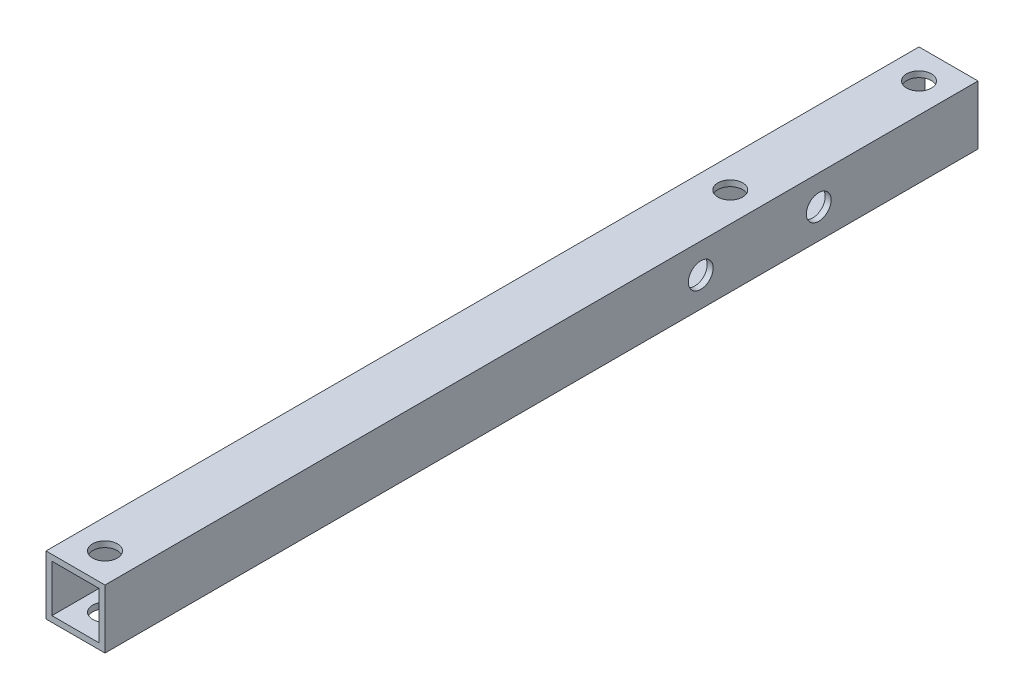
ISO-10303-21;
HEADER;
FILE_DESCRIPTION(('STEP AP214'),'2;1');
FILE_NAME('part.step','',(''),(''),'','','');
FILE_SCHEMA(('AUTOMOTIVE_DESIGN { 1 0 10303 214 1 1 1 1 }'));
ENDSEC;
DATA;
#1=APPLICATION_CONTEXT('core data for automotive mechanical design processes');
#2=APPLICATION_PROTOCOL_DEFINITION('international standard','automotive_design',2000,#1);
#3=PRODUCT_CONTEXT('',#1,'mechanical');
#4=PRODUCT('Part','Part','',(#3));
#5=PRODUCT_RELATED_PRODUCT_CATEGORY('part','',(#4));
#6=PRODUCT_DEFINITION_FORMATION('','',#4);
#7=PRODUCT_DEFINITION_CONTEXT('part definition',#1,'design');
#8=PRODUCT_DEFINITION('design','',#6,#7);
#9=PRODUCT_DEFINITION_SHAPE('','',#8);
#10=(LENGTH_UNIT() NAMED_UNIT(*) SI_UNIT(.MILLI.,.METRE.));
#11=(NAMED_UNIT(*) PLANE_ANGLE_UNIT() SI_UNIT($,.RADIAN.));
#12=(NAMED_UNIT(*) SI_UNIT($,.STERADIAN.) SOLID_ANGLE_UNIT());
#13=UNCERTAINTY_MEASURE_WITH_UNIT(LENGTH_MEASURE(1.E-05),#10,'distance_accuracy_value','');
#14=(GEOMETRIC_REPRESENTATION_CONTEXT(3) GLOBAL_UNCERTAINTY_ASSIGNED_CONTEXT((#13)) GLOBAL_UNIT_ASSIGNED_CONTEXT((#10,
#11,#12)) REPRESENTATION_CONTEXT('',''));
#15=CARTESIAN_POINT('',(0.,0.,0.));
#16=DIRECTION('',(0.,0.,1.));
#17=DIRECTION('',(1.,0.,0.));
#18=AXIS2_PLACEMENT_3D('',#15,#16,#17);
#19=CARTESIAN_POINT('',(0.,0.,148.));
#20=DIRECTION('',(0.,0.,1.));
#21=DIRECTION('',(1.,0.,0.));
#22=AXIS2_PLACEMENT_3D('',#19,#20,#21);
#23=PLANE('',#22);
#24=DIRECTION('',(0.,-1.,0.));
#25=VECTOR('',#24,1.);
#26=CARTESIAN_POINT('',(0.,0.,148.));
#27=LINE('',#26,#25);
#28=CARTESIAN_POINT('',(0.,0.,148.));
#29=VERTEX_POINT('',#28);
#30=CARTESIAN_POINT('',(0.,-10.,148.));
#31=VERTEX_POINT('',#30);
#32=EDGE_CURVE('E185',#29,#31,#27,.T.);
#33=ORIENTED_EDGE('',*,*,#32,.T.);
#34=DIRECTION('',(1.,0.,0.));
#35=VECTOR('',#34,1.);
#36=CARTESIAN_POINT('',(0.,-10.,148.));
#37=LINE('',#36,#35);
#38=CARTESIAN_POINT('',(10.,-10.,148.));
#39=VERTEX_POINT('',#38);
#40=EDGE_CURVE('E189',#31,#39,#37,.T.);
#41=ORIENTED_EDGE('',*,*,#40,.T.);
#42=DIRECTION('',(0.,1.,0.));
#43=VECTOR('',#42,1.);
#44=CARTESIAN_POINT('',(10.,0.,148.));
#45=LINE('',#44,#43);
#46=CARTESIAN_POINT('',(10.,0.,148.));
#47=VERTEX_POINT('',#46);
#48=EDGE_CURVE('E193',#39,#47,#45,.T.);
#49=ORIENTED_EDGE('',*,*,#48,.T.);
#50=DIRECTION('',(-1.,0.,0.));
#51=VECTOR('',#50,1.);
#52=CARTESIAN_POINT('',(0.,0.,148.));
#53=LINE('',#52,#51);
#54=EDGE_CURVE('E196',#47,#29,#53,.T.);
#55=ORIENTED_EDGE('',*,*,#54,.T.);
#56=EDGE_LOOP('',(#33,#41,#49,#55));
#57=FACE_BOUND('',#56,.T.);
#58=DIRECTION('',(1.,0.,0.));
#59=VECTOR('',#58,1.);
#60=CARTESIAN_POINT('',(0.,-9.,148.));
#61=LINE('',#60,#59);
#62=CARTESIAN_POINT('',(1.,-9.,148.));
#63=VERTEX_POINT('',#62);
#64=CARTESIAN_POINT('',(9.,-9.,148.));
#65=VERTEX_POINT('',#64);
#66=EDGE_CURVE('E144',#63,#65,#61,.T.);
#67=ORIENTED_EDGE('',*,*,#66,.F.);
#68=DIRECTION('',(0.,-1.,0.));
#69=VECTOR('',#68,1.);
#70=CARTESIAN_POINT('',(1.,0.,148.));
#71=LINE('',#70,#69);
#72=CARTESIAN_POINT('',(1.,-1.,148.));
#73=VERTEX_POINT('',#72);
#74=EDGE_CURVE('E135',#73,#63,#71,.T.);
#75=ORIENTED_EDGE('',*,*,#74,.F.);
#76=DIRECTION('',(-1.,0.,0.));
#77=VECTOR('',#76,1.);
#78=CARTESIAN_POINT('',(0.,-1.,148.));
#79=LINE('',#78,#77);
#80=CARTESIAN_POINT('',(9.,-1.,148.));
#81=VERTEX_POINT('',#80);
#82=EDGE_CURVE('E161',#81,#73,#79,.T.);
#83=ORIENTED_EDGE('',*,*,#82,.F.);
#84=DIRECTION('',(0.,1.,0.));
#85=VECTOR('',#84,1.);
#86=CARTESIAN_POINT('',(9.,0.,148.));
#87=LINE('',#86,#85);
#88=EDGE_CURVE('E157',#65,#81,#87,.T.);
#89=ORIENTED_EDGE('',*,*,#88,.F.);
#90=EDGE_LOOP('',(#67,#75,#83,#89));
#91=FACE_BOUND('',#90,.T.);
#92=ADVANCED_FACE('F67',(#57,#91),#23,.T.);
#93=CARTESIAN_POINT('',(0.,0.,0.));
#94=DIRECTION('',(0.,0.,1.));
#95=DIRECTION('',(1.,0.,0.));
#96=AXIS2_PLACEMENT_3D('',#93,#94,#95);
#97=PLANE('',#96);
#98=DIRECTION('',(0.,-1.,0.));
#99=VECTOR('',#98,1.);
#100=CARTESIAN_POINT('',(0.,0.,0.));
#101=LINE('',#100,#99);
#102=CARTESIAN_POINT('',(0.,0.,0.));
#103=VERTEX_POINT('',#102);
#104=CARTESIAN_POINT('',(0.,-10.,0.));
#105=VERTEX_POINT('',#104);
#106=EDGE_CURVE('E153',#103,#105,#101,.T.);
#107=ORIENTED_EDGE('',*,*,#106,.F.);
#108=DIRECTION('',(-1.,0.,0.));
#109=VECTOR('',#108,1.);
#110=CARTESIAN_POINT('',(0.,0.,0.));
#111=LINE('',#110,#109);
#112=CARTESIAN_POINT('',(10.,0.,0.));
#113=VERTEX_POINT('',#112);
#114=EDGE_CURVE('E190',#113,#103,#111,.T.);
#115=ORIENTED_EDGE('',*,*,#114,.F.);
#116=DIRECTION('',(0.,1.,0.));
#117=VECTOR('',#116,1.);
#118=CARTESIAN_POINT('',(10.,0.,0.));
#119=LINE('',#118,#117);
#120=CARTESIAN_POINT('',(10.,-10.,0.));
#121=VERTEX_POINT('',#120);
#122=EDGE_CURVE('E206',#121,#113,#119,.T.);
#123=ORIENTED_EDGE('',*,*,#122,.F.);
#124=DIRECTION('',(1.,0.,0.));
#125=VECTOR('',#124,1.);
#126=CARTESIAN_POINT('',(0.,-10.,0.));
#127=LINE('',#126,#125);
#128=EDGE_CURVE('E203',#105,#121,#127,.T.);
#129=ORIENTED_EDGE('',*,*,#128,.F.);
#130=EDGE_LOOP('',(#107,#115,#123,#129));
#131=FACE_BOUND('',#130,.T.);
#132=DIRECTION('',(0.,-1.,0.));
#133=VECTOR('',#132,1.);
#134=CARTESIAN_POINT('',(1.,0.,0.));
#135=LINE('',#134,#133);
#136=CARTESIAN_POINT('',(1.,-1.,0.));
#137=VERTEX_POINT('',#136);
#138=CARTESIAN_POINT('',(1.,-9.,0.));
#139=VERTEX_POINT('',#138);
#140=EDGE_CURVE('E93',#137,#139,#135,.T.);
#141=ORIENTED_EDGE('',*,*,#140,.T.);
#142=DIRECTION('',(1.,0.,0.));
#143=VECTOR('',#142,1.);
#144=CARTESIAN_POINT('',(0.,-9.,0.));
#145=LINE('',#144,#143);
#146=CARTESIAN_POINT('',(9.,-9.,0.));
#147=VERTEX_POINT('',#146);
#148=EDGE_CURVE('E151',#139,#147,#145,.T.);
#149=ORIENTED_EDGE('',*,*,#148,.T.);
#150=DIRECTION('',(0.,1.,0.));
#151=VECTOR('',#150,1.);
#152=CARTESIAN_POINT('',(9.,0.,0.));
#153=LINE('',#152,#151);
#154=CARTESIAN_POINT('',(9.,-1.,0.));
#155=VERTEX_POINT('',#154);
#156=EDGE_CURVE('E172',#147,#155,#153,.T.);
#157=ORIENTED_EDGE('',*,*,#156,.T.);
#158=DIRECTION('',(-1.,0.,0.));
#159=VECTOR('',#158,1.);
#160=CARTESIAN_POINT('',(0.,-1.,0.));
#161=LINE('',#160,#159);
#162=EDGE_CURVE('E145',#155,#137,#161,.T.);
#163=ORIENTED_EDGE('',*,*,#162,.T.);
#164=EDGE_LOOP('',(#141,#149,#157,#163));
#165=FACE_BOUND('',#164,.T.);
#166=ADVANCED_FACE('F302',(#131,#165),#97,.F.);
#167=CARTESIAN_POINT('',(0.,0.,148.));
#168=DIRECTION('',(1.,0.,0.));
#169=DIRECTION('',(0.,1.,0.));
#170=AXIS2_PLACEMENT_3D('',#167,#168,#169);
#171=PLANE('',#170);
#172=CARTESIAN_POINT('',(0.,-5.00000000000001,27.));
#173=DIRECTION('',(1.,0.,0.));
#174=DIRECTION('',(0.,1.,0.));
#175=AXIS2_PLACEMENT_3D('',#172,#173,#174);
#176=CIRCLE('',#175,2.1);
#177=CARTESIAN_POINT('',(0.,-2.90000000000001,27.));
#178=VERTEX_POINT('',#177);
#179=EDGE_CURVE('E169',#178,#178,#176,.T.);
#180=ORIENTED_EDGE('',*,*,#179,.T.);
#181=EDGE_LOOP('',(#180));
#182=FACE_BOUND('',#181,.T.);
#183=CARTESIAN_POINT('',(0.,-5.00000000000001,47.));
#184=DIRECTION('',(1.,0.,0.));
#185=DIRECTION('',(0.,1.,0.));
#186=AXIS2_PLACEMENT_3D('',#183,#184,#185);
#187=CIRCLE('',#186,2.1);
#188=CARTESIAN_POINT('',(0.,-2.9,47.));
#189=VERTEX_POINT('',#188);
#190=EDGE_CURVE('E232',#189,#189,#187,.T.);
#191=ORIENTED_EDGE('',*,*,#190,.T.);
#192=EDGE_LOOP('',(#191));
#193=FACE_BOUND('',#192,.T.);
#194=ORIENTED_EDGE('',*,*,#106,.T.);
#195=DIRECTION('',(0.,0.,-1.));
#196=VECTOR('',#195,1.);
#197=CARTESIAN_POINT('',(0.,-10.,148.));
#198=LINE('',#197,#196);
#199=EDGE_CURVE('E12',#31,#105,#198,.T.);
#200=ORIENTED_EDGE('',*,*,#199,.F.);
#201=ORIENTED_EDGE('',*,*,#32,.F.);
#202=DIRECTION('',(0.,0.,-1.));
#203=VECTOR('',#202,1.);
#204=CARTESIAN_POINT('',(0.,0.,148.));
#205=LINE('',#204,#203);
#206=EDGE_CURVE('E199',#29,#103,#205,.T.);
#207=ORIENTED_EDGE('',*,*,#206,.T.);
#208=EDGE_LOOP('',(#194,#200,#201,#207));
#209=FACE_BOUND('',#208,.T.);
#210=ADVANCED_FACE('F69',(#182,#193,#209),#171,.F.);
#211=CARTESIAN_POINT('',(0.,-10.,148.));
#212=DIRECTION('',(0.,1.,0.));
#213=DIRECTION('',(0.,0.,1.));
#214=AXIS2_PLACEMENT_3D('',#211,#212,#213);
#215=PLANE('',#214);
#216=CARTESIAN_POINT('',(5.,-10.,143.));
#217=DIRECTION('',(0.,1.,0.));
#218=DIRECTION('',(0.,0.,-1.));
#219=AXIS2_PLACEMENT_3D('',#216,#217,#218);
#220=CIRCLE('',#219,2.09999999999999);
#221=CARTESIAN_POINT('',(5.,-10.,140.9));
#222=VERTEX_POINT('',#221);
#223=EDGE_CURVE('E329',#222,#222,#220,.T.);
#224=ORIENTED_EDGE('',*,*,#223,.T.);
#225=EDGE_LOOP('',(#224));
#226=FACE_BOUND('',#225,.T.);
#227=CARTESIAN_POINT('',(5.,-10.,5.));
#228=DIRECTION('',(0.,1.,0.));
#229=DIRECTION('',(0.,0.,1.));
#230=AXIS2_PLACEMENT_3D('',#227,#228,#229);
#231=CIRCLE('',#230,2.1);
#232=CARTESIAN_POINT('',(5.,-10.,7.1));
#233=VERTEX_POINT('',#232);
#234=EDGE_CURVE('E333',#233,#233,#231,.T.);
#235=ORIENTED_EDGE('',*,*,#234,.T.);
#236=EDGE_LOOP('',(#235));
#237=FACE_BOUND('',#236,.T.);
#238=CARTESIAN_POINT('',(5.,-10.,37.));
#239=DIRECTION('',(0.,1.,0.));
#240=DIRECTION('',(0.,0.,1.));
#241=AXIS2_PLACEMENT_3D('',#238,#239,#240);
#242=CIRCLE('',#241,2.1);
#243=CARTESIAN_POINT('',(5.,-10.,39.1));
#244=VERTEX_POINT('',#243);
#245=EDGE_CURVE('E237',#244,#244,#242,.T.);
#246=ORIENTED_EDGE('',*,*,#245,.T.);
#247=EDGE_LOOP('',(#246));
#248=FACE_BOUND('',#247,.T.);
#249=ORIENTED_EDGE('',*,*,#128,.T.);
#250=DIRECTION('',(0.,0.,-1.));
#251=VECTOR('',#250,1.);
#252=CARTESIAN_POINT('',(10.,-10.,148.));
#253=LINE('',#252,#251);
#254=EDGE_CURVE('E77',#39,#121,#253,.T.);
#255=ORIENTED_EDGE('',*,*,#254,.F.);
#256=ORIENTED_EDGE('',*,*,#40,.F.);
#257=ORIENTED_EDGE('',*,*,#199,.T.);
#258=EDGE_LOOP('',(#249,#255,#256,#257));
#259=FACE_BOUND('',#258,.T.);
#260=ADVANCED_FACE('F319',(#226,#237,#248,#259),#215,.F.);
#261=CARTESIAN_POINT('',(10.,0.,148.));
#262=DIRECTION('',(-1.,0.,0.));
#263=DIRECTION('',(0.,-1.,0.));
#264=AXIS2_PLACEMENT_3D('',#261,#262,#263);
#265=PLANE('',#264);
#266=CARTESIAN_POINT('',(10.,-5.00000000000001,27.));
#267=DIRECTION('',(-1.,0.,0.));
#268=DIRECTION('',(0.,-1.,0.));
#269=AXIS2_PLACEMENT_3D('',#266,#267,#268);
#270=CIRCLE('',#269,2.1);
#271=CARTESIAN_POINT('',(10.,-7.10000000000001,27.));
#272=VERTEX_POINT('',#271);
#273=EDGE_CURVE('E226',#272,#272,#270,.T.);
#274=ORIENTED_EDGE('',*,*,#273,.T.);
#275=EDGE_LOOP('',(#274));
#276=FACE_BOUND('',#275,.T.);
#277=CARTESIAN_POINT('',(10.,-5.00000000000001,47.));
#278=DIRECTION('',(-1.,0.,0.));
#279=DIRECTION('',(0.,1.,0.));
#280=AXIS2_PLACEMENT_3D('',#277,#278,#279);
#281=CIRCLE('',#280,2.1);
#282=CARTESIAN_POINT('',(10.,-2.9,47.));
#283=VERTEX_POINT('',#282);
#284=EDGE_CURVE('E260',#283,#283,#281,.T.);
#285=ORIENTED_EDGE('',*,*,#284,.T.);
#286=EDGE_LOOP('',(#285));
#287=FACE_BOUND('',#286,.T.);
#288=ORIENTED_EDGE('',*,*,#122,.T.);
#289=DIRECTION('',(0.,0.,-1.));
#290=VECTOR('',#289,1.);
#291=CARTESIAN_POINT('',(10.,0.,148.));
#292=LINE('',#291,#290);
#293=EDGE_CURVE('E214',#47,#113,#292,.T.);
#294=ORIENTED_EDGE('',*,*,#293,.F.);
#295=ORIENTED_EDGE('',*,*,#48,.F.);
#296=ORIENTED_EDGE('',*,*,#254,.T.);
#297=EDGE_LOOP('',(#288,#294,#295,#296));
#298=FACE_BOUND('',#297,.T.);
#299=ADVANCED_FACE('F316',(#276,#287,#298),#265,.F.);
#300=CARTESIAN_POINT('',(0.,0.,148.));
#301=DIRECTION('',(0.,-1.,0.));
#302=DIRECTION('',(0.,0.,-1.));
#303=AXIS2_PLACEMENT_3D('',#300,#301,#302);
#304=PLANE('',#303);
#305=CARTESIAN_POINT('',(5.,0.,143.));
#306=DIRECTION('',(0.,1.,0.));
#307=DIRECTION('',(0.,0.,-1.));
#308=AXIS2_PLACEMENT_3D('',#305,#306,#307);
#309=CIRCLE('',#308,2.09999999999999);
#310=CARTESIAN_POINT('',(5.,0.,140.9));
#311=VERTEX_POINT('',#310);
#312=EDGE_CURVE('E384',#311,#311,#309,.T.);
#313=ORIENTED_EDGE('',*,*,#312,.F.);
#314=EDGE_LOOP('',(#313));
#315=FACE_BOUND('',#314,.T.);
#316=CARTESIAN_POINT('',(5.,0.,5.));
#317=DIRECTION('',(0.,1.,0.));
#318=DIRECTION('',(0.,0.,1.));
#319=AXIS2_PLACEMENT_3D('',#316,#317,#318);
#320=CIRCLE('',#319,2.1);
#321=CARTESIAN_POINT('',(5.,0.,7.1));
#322=VERTEX_POINT('',#321);
#323=EDGE_CURVE('E383',#322,#322,#320,.T.);
#324=ORIENTED_EDGE('',*,*,#323,.F.);
#325=EDGE_LOOP('',(#324));
#326=FACE_BOUND('',#325,.T.);
#327=CARTESIAN_POINT('',(5.,0.,37.));
#328=DIRECTION('',(0.,1.,0.));
#329=DIRECTION('',(0.,0.,1.));
#330=AXIS2_PLACEMENT_3D('',#327,#328,#329);
#331=CIRCLE('',#330,2.1);
#332=CARTESIAN_POINT('',(5.,0.,39.1));
#333=VERTEX_POINT('',#332);
#334=EDGE_CURVE('E253',#333,#333,#331,.T.);
#335=ORIENTED_EDGE('',*,*,#334,.F.);
#336=EDGE_LOOP('',(#335));
#337=FACE_BOUND('',#336,.T.);
#338=ORIENTED_EDGE('',*,*,#114,.T.);
#339=ORIENTED_EDGE('',*,*,#206,.F.);
#340=ORIENTED_EDGE('',*,*,#54,.F.);
#341=ORIENTED_EDGE('',*,*,#293,.T.);
#342=EDGE_LOOP('',(#338,#339,#340,#341));
#343=FACE_BOUND('',#342,.T.);
#344=ADVANCED_FACE('F313',(#315,#326,#337,#343),#304,.F.);
#345=CARTESIAN_POINT('',(1.,0.,148.));
#346=DIRECTION('',(1.,0.,0.));
#347=DIRECTION('',(0.,1.,0.));
#348=AXIS2_PLACEMENT_3D('',#345,#346,#347);
#349=PLANE('',#348);
#350=CARTESIAN_POINT('',(1.,-5.00000000000001,27.));
#351=DIRECTION('',(1.,0.,0.));
#352=DIRECTION('',(0.,1.,0.));
#353=AXIS2_PLACEMENT_3D('',#350,#351,#352);
#354=CIRCLE('',#353,2.1);
#355=CARTESIAN_POINT('',(1.,-2.90000000000001,27.));
#356=VERTEX_POINT('',#355);
#357=EDGE_CURVE('E231',#356,#356,#354,.T.);
#358=ORIENTED_EDGE('',*,*,#357,.F.);
#359=EDGE_LOOP('',(#358));
#360=FACE_BOUND('',#359,.T.);
#361=CARTESIAN_POINT('',(1.,-5.00000000000001,47.));
#362=DIRECTION('',(1.,0.,0.));
#363=DIRECTION('',(0.,1.,0.));
#364=AXIS2_PLACEMENT_3D('',#361,#362,#363);
#365=CIRCLE('',#364,2.1);
#366=CARTESIAN_POINT('',(1.,-2.9,47.));
#367=VERTEX_POINT('',#366);
#368=EDGE_CURVE('E225',#367,#367,#365,.T.);
#369=ORIENTED_EDGE('',*,*,#368,.F.);
#370=EDGE_LOOP('',(#369));
#371=FACE_BOUND('',#370,.T.);
#372=ORIENTED_EDGE('',*,*,#140,.F.);
#373=DIRECTION('',(0.,0.,-1.));
#374=VECTOR('',#373,1.);
#375=CARTESIAN_POINT('',(1.,-1.,148.));
#376=LINE('',#375,#374);
#377=EDGE_CURVE('E139',#73,#137,#376,.T.);
#378=ORIENTED_EDGE('',*,*,#377,.F.);
#379=ORIENTED_EDGE('',*,*,#74,.T.);
#380=DIRECTION('',(0.,0.,-1.));
#381=VECTOR('',#380,1.);
#382=CARTESIAN_POINT('',(1.,-9.,148.));
#383=LINE('',#382,#381);
#384=EDGE_CURVE('E138',#63,#139,#383,.T.);
#385=ORIENTED_EDGE('',*,*,#384,.T.);
#386=EDGE_LOOP('',(#372,#378,#379,#385));
#387=FACE_BOUND('',#386,.T.);
#388=ADVANCED_FACE('F137',(#360,#371,#387),#349,.T.);
#389=CARTESIAN_POINT('',(0.,-9.,148.));
#390=DIRECTION('',(0.,1.,0.));
#391=DIRECTION('',(0.,0.,1.));
#392=AXIS2_PLACEMENT_3D('',#389,#390,#391);
#393=PLANE('',#392);
#394=CARTESIAN_POINT('',(5.,-9.,143.));
#395=DIRECTION('',(0.,1.,0.));
#396=DIRECTION('',(0.,0.,1.));
#397=AXIS2_PLACEMENT_3D('',#394,#395,#396);
#398=CIRCLE('',#397,2.09999999999999);
#399=CARTESIAN_POINT('',(5.,-9.,145.1));
#400=VERTEX_POINT('',#399);
#401=EDGE_CURVE('E256',#400,#400,#398,.T.);
#402=ORIENTED_EDGE('',*,*,#401,.F.);
#403=EDGE_LOOP('',(#402));
#404=FACE_BOUND('',#403,.T.);
#405=CARTESIAN_POINT('',(5.,-9.,5.));
#406=DIRECTION('',(0.,1.,0.));
#407=DIRECTION('',(0.,0.,1.));
#408=AXIS2_PLACEMENT_3D('',#405,#406,#407);
#409=CIRCLE('',#408,2.1);
#410=CARTESIAN_POINT('',(5.,-9.,7.1));
#411=VERTEX_POINT('',#410);
#412=EDGE_CURVE('E241',#411,#411,#409,.T.);
#413=ORIENTED_EDGE('',*,*,#412,.F.);
#414=EDGE_LOOP('',(#413));
#415=FACE_BOUND('',#414,.T.);
#416=CARTESIAN_POINT('',(5.,-9.,37.));
#417=DIRECTION('',(0.,1.,0.));
#418=DIRECTION('',(0.,0.,1.));
#419=AXIS2_PLACEMENT_3D('',#416,#417,#418);
#420=CIRCLE('',#419,2.1);
#421=CARTESIAN_POINT('',(5.,-9.,39.1));
#422=VERTEX_POINT('',#421);
#423=EDGE_CURVE('E236',#422,#422,#420,.T.);
#424=ORIENTED_EDGE('',*,*,#423,.F.);
#425=EDGE_LOOP('',(#424));
#426=FACE_BOUND('',#425,.T.);
#427=ORIENTED_EDGE('',*,*,#148,.F.);
#428=ORIENTED_EDGE('',*,*,#384,.F.);
#429=ORIENTED_EDGE('',*,*,#66,.T.);
#430=DIRECTION('',(0.,0.,-1.));
#431=VECTOR('',#430,1.);
#432=CARTESIAN_POINT('',(9.,-9.,148.));
#433=LINE('',#432,#431);
#434=EDGE_CURVE('E154',#65,#147,#433,.T.);
#435=ORIENTED_EDGE('',*,*,#434,.T.);
#436=EDGE_LOOP('',(#427,#428,#429,#435));
#437=FACE_BOUND('',#436,.T.);
#438=ADVANCED_FACE('F148',(#404,#415,#426,#437),#393,.T.);
#439=CARTESIAN_POINT('',(9.,0.,148.));
#440=DIRECTION('',(-1.,0.,0.));
#441=DIRECTION('',(0.,-1.,0.));
#442=AXIS2_PLACEMENT_3D('',#439,#440,#441);
#443=PLANE('',#442);
#444=CARTESIAN_POINT('',(9.,-5.00000000000001,27.));
#445=DIRECTION('',(-1.,0.,0.));
#446=DIRECTION('',(0.,-1.,0.));
#447=AXIS2_PLACEMENT_3D('',#444,#445,#446);
#448=CIRCLE('',#447,2.1);
#449=CARTESIAN_POINT('',(9.,-7.10000000000001,27.));
#450=VERTEX_POINT('',#449);
#451=EDGE_CURVE('E227',#450,#450,#448,.T.);
#452=ORIENTED_EDGE('',*,*,#451,.F.);
#453=EDGE_LOOP('',(#452));
#454=FACE_BOUND('',#453,.T.);
#455=CARTESIAN_POINT('',(9.,-5.00000000000001,47.));
#456=DIRECTION('',(-1.,0.,0.));
#457=DIRECTION('',(0.,-1.,0.));
#458=AXIS2_PLACEMENT_3D('',#455,#456,#457);
#459=CIRCLE('',#458,2.1);
#460=CARTESIAN_POINT('',(9.,-7.10000000000001,47.));
#461=VERTEX_POINT('',#460);
#462=EDGE_CURVE('E221',#461,#461,#459,.T.);
#463=ORIENTED_EDGE('',*,*,#462,.F.);
#464=EDGE_LOOP('',(#463));
#465=FACE_BOUND('',#464,.T.);
#466=ORIENTED_EDGE('',*,*,#156,.F.);
#467=ORIENTED_EDGE('',*,*,#434,.F.);
#468=ORIENTED_EDGE('',*,*,#88,.T.);
#469=DIRECTION('',(0.,0.,-1.));
#470=VECTOR('',#469,1.);
#471=CARTESIAN_POINT('',(9.,-1.,148.));
#472=LINE('',#471,#470);
#473=EDGE_CURVE('E85',#81,#155,#472,.T.);
#474=ORIENTED_EDGE('',*,*,#473,.T.);
#475=EDGE_LOOP('',(#466,#467,#468,#474));
#476=FACE_BOUND('',#475,.T.);
#477=ADVANCED_FACE('F354',(#454,#465,#476),#443,.T.);
#478=CARTESIAN_POINT('',(0.,-1.,148.));
#479=DIRECTION('',(0.,-1.,0.));
#480=DIRECTION('',(0.,0.,-1.));
#481=AXIS2_PLACEMENT_3D('',#478,#479,#480);
#482=PLANE('',#481);
#483=CARTESIAN_POINT('',(5.,-0.999999999999999,143.));
#484=DIRECTION('',(0.,-1.,0.));
#485=DIRECTION('',(0.,0.,-1.));
#486=AXIS2_PLACEMENT_3D('',#483,#484,#485);
#487=CIRCLE('',#486,2.09999999999999);
#488=CARTESIAN_POINT('',(5.,-0.999999999999999,140.9));
#489=VERTEX_POINT('',#488);
#490=EDGE_CURVE('E71',#489,#489,#487,.T.);
#491=ORIENTED_EDGE('',*,*,#490,.F.);
#492=EDGE_LOOP('',(#491));
#493=FACE_BOUND('',#492,.T.);
#494=CARTESIAN_POINT('',(5.,-0.999999999999999,5.));
#495=DIRECTION('',(0.,-1.,0.));
#496=DIRECTION('',(0.,0.,-1.));
#497=AXIS2_PLACEMENT_3D('',#494,#495,#496);
#498=CIRCLE('',#497,2.1);
#499=CARTESIAN_POINT('',(5.,-0.999999999999999,2.9));
#500=VERTEX_POINT('',#499);
#501=EDGE_CURVE('E238',#500,#500,#498,.T.);
#502=ORIENTED_EDGE('',*,*,#501,.F.);
#503=EDGE_LOOP('',(#502));
#504=FACE_BOUND('',#503,.T.);
#505=CARTESIAN_POINT('',(5.,-0.999999999999999,37.));
#506=DIRECTION('',(0.,-1.,0.));
#507=DIRECTION('',(0.,0.,-1.));
#508=AXIS2_PLACEMENT_3D('',#505,#506,#507);
#509=CIRCLE('',#508,2.1);
#510=CARTESIAN_POINT('',(5.,-0.999999999999999,34.9));
#511=VERTEX_POINT('',#510);
#512=EDGE_CURVE('E233',#511,#511,#509,.T.);
#513=ORIENTED_EDGE('',*,*,#512,.F.);
#514=EDGE_LOOP('',(#513));
#515=FACE_BOUND('',#514,.T.);
#516=ORIENTED_EDGE('',*,*,#162,.F.);
#517=ORIENTED_EDGE('',*,*,#473,.F.);
#518=ORIENTED_EDGE('',*,*,#82,.T.);
#519=ORIENTED_EDGE('',*,*,#377,.T.);
#520=EDGE_LOOP('',(#516,#517,#518,#519));
#521=FACE_BOUND('',#520,.T.);
#522=ADVANCED_FACE('F352',(#493,#504,#515,#521),#482,.T.);
#523=CARTESIAN_POINT('',(10.,-5.00000000000001,47.));
#524=DIRECTION('',(-1.,0.,0.));
#525=DIRECTION('',(0.,-1.,0.));
#526=AXIS2_PLACEMENT_3D('',#523,#524,#525);
#527=CYLINDRICAL_SURFACE('',#526,2.1);
#528=ORIENTED_EDGE('',*,*,#462,.T.);
#529=EDGE_LOOP('',(#528));
#530=FACE_BOUND('',#529,.T.);
#531=ORIENTED_EDGE('',*,*,#284,.F.);
#532=EDGE_LOOP('',(#531));
#533=FACE_BOUND('',#532,.T.);
#534=ADVANCED_FACE('F298',(#530,#533),#527,.F.);
#535=CARTESIAN_POINT('',(10.,-5.00000000000001,27.));
#536=DIRECTION('',(-1.,0.,0.));
#537=DIRECTION('',(0.,-1.,0.));
#538=AXIS2_PLACEMENT_3D('',#535,#536,#537);
#539=CYLINDRICAL_SURFACE('',#538,2.1);
#540=ORIENTED_EDGE('',*,*,#451,.T.);
#541=EDGE_LOOP('',(#540));
#542=FACE_BOUND('',#541,.T.);
#543=ORIENTED_EDGE('',*,*,#273,.F.);
#544=EDGE_LOOP('',(#543));
#545=FACE_BOUND('',#544,.T.);
#546=ADVANCED_FACE('F287',(#542,#545),#539,.F.);
#547=ORIENTED_EDGE('',*,*,#368,.T.);
#548=EDGE_LOOP('',(#547));
#549=FACE_BOUND('',#548,.T.);
#550=ORIENTED_EDGE('',*,*,#190,.F.);
#551=EDGE_LOOP('',(#550));
#552=FACE_BOUND('',#551,.T.);
#553=ADVANCED_FACE('F284',(#549,#552),#527,.F.);
#554=ORIENTED_EDGE('',*,*,#357,.T.);
#555=EDGE_LOOP('',(#554));
#556=FACE_BOUND('',#555,.T.);
#557=ORIENTED_EDGE('',*,*,#179,.F.);
#558=EDGE_LOOP('',(#557));
#559=FACE_BOUND('',#558,.T.);
#560=ADVANCED_FACE('F281',(#556,#559),#539,.F.);
#561=CARTESIAN_POINT('',(5.,-10.,37.));
#562=DIRECTION('',(0.,1.,0.));
#563=DIRECTION('',(0.,0.,1.));
#564=AXIS2_PLACEMENT_3D('',#561,#562,#563);
#565=CYLINDRICAL_SURFACE('',#564,2.1);
#566=ORIENTED_EDGE('',*,*,#512,.T.);
#567=EDGE_LOOP('',(#566));
#568=FACE_BOUND('',#567,.T.);
#569=ORIENTED_EDGE('',*,*,#334,.T.);
#570=EDGE_LOOP('',(#569));
#571=FACE_BOUND('',#570,.T.);
#572=ADVANCED_FACE('F283',(#568,#571),#565,.F.);
#573=CARTESIAN_POINT('',(5.,-10.,5.));
#574=DIRECTION('',(0.,1.,0.));
#575=DIRECTION('',(0.,0.,1.));
#576=AXIS2_PLACEMENT_3D('',#573,#574,#575);
#577=CYLINDRICAL_SURFACE('',#576,2.1);
#578=ORIENTED_EDGE('',*,*,#501,.T.);
#579=EDGE_LOOP('',(#578));
#580=FACE_BOUND('',#579,.T.);
#581=ORIENTED_EDGE('',*,*,#323,.T.);
#582=EDGE_LOOP('',(#581));
#583=FACE_BOUND('',#582,.T.);
#584=ADVANCED_FACE('F292',(#580,#583),#577,.F.);
#585=CARTESIAN_POINT('',(5.,-10.,143.));
#586=DIRECTION('',(0.,1.,0.));
#587=DIRECTION('',(0.,0.,1.));
#588=AXIS2_PLACEMENT_3D('',#585,#586,#587);
#589=CYLINDRICAL_SURFACE('',#588,2.09999999999999);
#590=ORIENTED_EDGE('',*,*,#490,.T.);
#591=EDGE_LOOP('',(#590));
#592=FACE_BOUND('',#591,.T.);
#593=ORIENTED_EDGE('',*,*,#312,.T.);
#594=EDGE_LOOP('',(#593));
#595=FACE_BOUND('',#594,.T.);
#596=ADVANCED_FACE('F402',(#592,#595),#589,.F.);
#597=ORIENTED_EDGE('',*,*,#423,.T.);
#598=EDGE_LOOP('',(#597));
#599=FACE_BOUND('',#598,.T.);
#600=ORIENTED_EDGE('',*,*,#245,.F.);
#601=EDGE_LOOP('',(#600));
#602=FACE_BOUND('',#601,.T.);
#603=ADVANCED_FACE('F295',(#599,#602),#565,.F.);
#604=ORIENTED_EDGE('',*,*,#412,.T.);
#605=EDGE_LOOP('',(#604));
#606=FACE_BOUND('',#605,.T.);
#607=ORIENTED_EDGE('',*,*,#234,.F.);
#608=EDGE_LOOP('',(#607));
#609=FACE_BOUND('',#608,.T.);
#610=ADVANCED_FACE('F377',(#606,#609),#577,.F.);
#611=ORIENTED_EDGE('',*,*,#401,.T.);
#612=EDGE_LOOP('',(#611));
#613=FACE_BOUND('',#612,.T.);
#614=ORIENTED_EDGE('',*,*,#223,.F.);
#615=EDGE_LOOP('',(#614));
#616=FACE_BOUND('',#615,.T.);
#617=ADVANCED_FACE('F380',(#613,#616),#589,.F.);
#618=CLOSED_SHELL('',(#92,#166,#210,#260,#299,#344,#388,#438,#477,#522,#534,#546,#553,#560,#572,
#584,#596,#603,#610,#617));
#619=MANIFOLD_SOLID_BREP('B2',#618);
#620=ADVANCED_BREP_SHAPE_REPRESENTATION('',(#18,#619),#14);
#621=SHAPE_DEFINITION_REPRESENTATION(#9,#620);
ENDSEC;
END-ISO-10303-21;
